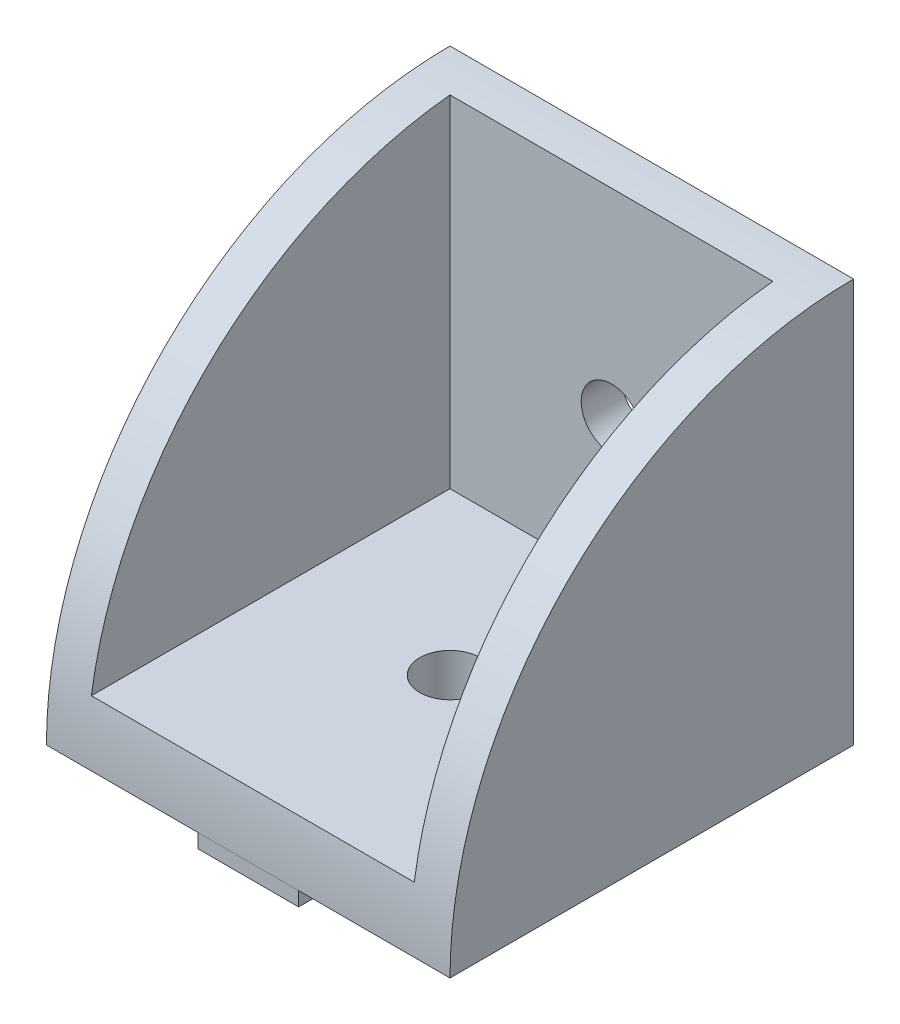
ISO-10303-21;
HEADER;
FILE_DESCRIPTION(('STEP AP214'),'2;1');
FILE_NAME('part.step','',(''),(''),'','','');
FILE_SCHEMA(('AUTOMOTIVE_DESIGN { 1 0 10303 214 1 1 1 1 }'));
ENDSEC;
DATA;
#1=APPLICATION_CONTEXT('core data for automotive mechanical design processes');
#2=APPLICATION_PROTOCOL_DEFINITION('international standard','automotive_design',2000,#1);
#3=PRODUCT_CONTEXT('',#1,'mechanical');
#4=PRODUCT('Part','Part','',(#3));
#5=PRODUCT_RELATED_PRODUCT_CATEGORY('part','',(#4));
#6=PRODUCT_DEFINITION_FORMATION('','',#4);
#7=PRODUCT_DEFINITION_CONTEXT('part definition',#1,'design');
#8=PRODUCT_DEFINITION('design','',#6,#7);
#9=PRODUCT_DEFINITION_SHAPE('','',#8);
#10=(LENGTH_UNIT() NAMED_UNIT(*) SI_UNIT(.MILLI.,.METRE.));
#11=(NAMED_UNIT(*) PLANE_ANGLE_UNIT() SI_UNIT($,.RADIAN.));
#12=(NAMED_UNIT(*) SI_UNIT($,.STERADIAN.) SOLID_ANGLE_UNIT());
#13=UNCERTAINTY_MEASURE_WITH_UNIT(LENGTH_MEASURE(1.E-05),#10,'distance_accuracy_value','');
#14=(GEOMETRIC_REPRESENTATION_CONTEXT(3) GLOBAL_UNCERTAINTY_ASSIGNED_CONTEXT((#13)) GLOBAL_UNIT_ASSIGNED_CONTEXT((#10,
#11,#12)) REPRESENTATION_CONTEXT('',''));
#15=CARTESIAN_POINT('',(0.,0.,0.));
#16=DIRECTION('',(0.,0.,1.));
#17=DIRECTION('',(1.,0.,0.));
#18=AXIS2_PLACEMENT_3D('',#15,#16,#17);
#19=CARTESIAN_POINT('',(0.,0.,0.));
#20=DIRECTION('',(0.,1.,0.));
#21=DIRECTION('',(-1.,0.,0.));
#22=AXIS2_PLACEMENT_3D('',#19,#20,#21);
#23=PLANE('',#22);
#24=DIRECTION('',(0.,0.,-1.));
#25=VECTOR('',#24,1.);
#26=CARTESIAN_POINT('',(7.5,0.,20.));
#27=LINE('',#26,#25);
#28=CARTESIAN_POINT('',(7.5,0.,20.));
#29=VERTEX_POINT('',#28);
#30=CARTESIAN_POINT('',(7.5,0.,0.));
#31=VERTEX_POINT('',#30);
#32=EDGE_CURVE('E57',#29,#31,#27,.T.);
#33=ORIENTED_EDGE('',*,*,#32,.F.);
#34=DIRECTION('',(-1.,0.,0.));
#35=VECTOR('',#34,1.);
#36=CARTESIAN_POINT('',(0.,0.,20.));
#37=LINE('',#36,#35);
#38=CARTESIAN_POINT('',(0.,0.,20.));
#39=VERTEX_POINT('',#38);
#40=EDGE_CURVE('E191',#29,#39,#37,.T.);
#41=ORIENTED_EDGE('',*,*,#40,.T.);
#42=DIRECTION('',(0.,0.,-1.));
#43=VECTOR('',#42,1.);
#44=CARTESIAN_POINT('',(0.,0.,0.));
#45=LINE('',#44,#43);
#46=CARTESIAN_POINT('',(0.,0.,0.));
#47=VERTEX_POINT('',#46);
#48=EDGE_CURVE('E182',#39,#47,#45,.T.);
#49=ORIENTED_EDGE('',*,*,#48,.T.);
#50=DIRECTION('',(1.,0.,0.));
#51=VECTOR('',#50,1.);
#52=CARTESIAN_POINT('',(0.,0.,0.));
#53=LINE('',#52,#51);
#54=EDGE_CURVE('E186',#47,#31,#53,.T.);
#55=ORIENTED_EDGE('',*,*,#54,.T.);
#56=EDGE_LOOP('',(#33,#41,#49,#55));
#57=FACE_BOUND('',#56,.T.);
#58=ADVANCED_FACE('F33',(#57),#23,.F.);
#59=CARTESIAN_POINT('',(0.,3.,0.));
#60=DIRECTION('',(0.,1.,0.));
#61=DIRECTION('',(0.,0.,1.));
#62=AXIS2_PLACEMENT_3D('',#59,#60,#61);
#63=PLANE('',#62);
#64=CARTESIAN_POINT('',(10.,2.99999999999996,10.));
#65=DIRECTION('',(0.,1.,0.));
#66=DIRECTION('',(0.,0.,1.));
#67=AXIS2_PLACEMENT_3D('',#64,#65,#66);
#68=CIRCLE('',#67,1.5);
#69=CARTESIAN_POINT('',(10.,2.99999999999996,11.5));
#70=VERTEX_POINT('',#69);
#71=EDGE_CURVE('E137',#70,#70,#68,.T.);
#72=ORIENTED_EDGE('',*,*,#71,.F.);
#73=EDGE_LOOP('',(#72));
#74=FACE_BOUND('',#73,.T.);
#75=DIRECTION('',(0.,0.,-1.));
#76=VECTOR('',#75,1.);
#77=CARTESIAN_POINT('',(2.,2.99999999999999,2.00000000000001));
#78=LINE('',#77,#76);
#79=CARTESIAN_POINT('',(2.00000000000001,2.99999999999993,19.7737199332852));
#80=VERTEX_POINT('',#79);
#81=CARTESIAN_POINT('',(2.,2.99999999999999,2.00000000000001));
#82=VERTEX_POINT('',#81);
#83=EDGE_CURVE('E153',#80,#82,#78,.T.);
#84=ORIENTED_EDGE('',*,*,#83,.F.);
#85=DIRECTION('',(-1.,0.,0.));
#86=VECTOR('',#85,1.);
#87=CARTESIAN_POINT('',(20.,2.99999999999993,19.7737199332852));
#88=LINE('',#87,#86);
#89=CARTESIAN_POINT('',(18.,2.99999999999993,19.7737199332852));
#90=VERTEX_POINT('',#89);
#91=EDGE_CURVE('E11',#80,#90,#88,.F.);
#92=ORIENTED_EDGE('',*,*,#91,.T.);
#93=DIRECTION('',(0.,0.,1.));
#94=VECTOR('',#93,1.);
#95=CARTESIAN_POINT('',(18.,2.99999999999999,2.00000000000001));
#96=LINE('',#95,#94);
#97=CARTESIAN_POINT('',(18.,2.99999999999999,2.00000000000001));
#98=VERTEX_POINT('',#97);
#99=EDGE_CURVE('E157',#98,#90,#96,.T.);
#100=ORIENTED_EDGE('',*,*,#99,.F.);
#101=DIRECTION('',(1.,0.,0.));
#102=VECTOR('',#101,1.);
#103=CARTESIAN_POINT('',(2.,2.99999999999999,2.00000000000001));
#104=LINE('',#103,#102);
#105=EDGE_CURVE('E155',#82,#98,#104,.T.);
#106=ORIENTED_EDGE('',*,*,#105,.F.);
#107=EDGE_LOOP('',(#84,#92,#100,#106));
#108=FACE_BOUND('',#107,.T.);
#109=ADVANCED_FACE('F224',(#74,#108),#63,.T.);
#110=CARTESIAN_POINT('',(0.,0.,0.));
#111=DIRECTION('',(1.,0.,0.));
#112=DIRECTION('',(0.,0.,-1.));
#113=AXIS2_PLACEMENT_3D('',#110,#111,#112);
#114=PLANE('',#113);
#115=CARTESIAN_POINT('',(0.,0.,0.));
#116=DIRECTION('',(-1.,0.,0.));
#117=DIRECTION('',(0.,0.,1.));
#118=AXIS2_PLACEMENT_3D('',#115,#116,#117);
#119=CIRCLE('',#118,20.);
#120=CARTESIAN_POINT('',(0.,20.,0.));
#121=VERTEX_POINT('',#120);
#122=EDGE_CURVE('E42',#39,#121,#119,.T.);
#123=ORIENTED_EDGE('',*,*,#122,.T.);
#124=DIRECTION('',(0.,-1.,0.));
#125=VECTOR('',#124,1.);
#126=CARTESIAN_POINT('',(0.,0.,0.));
#127=LINE('',#126,#125);
#128=EDGE_CURVE('E174',#121,#47,#127,.T.);
#129=ORIENTED_EDGE('',*,*,#128,.T.);
#130=ORIENTED_EDGE('',*,*,#48,.F.);
#131=EDGE_LOOP('',(#123,#129,#130));
#132=FACE_BOUND('',#131,.T.);
#133=ADVANCED_FACE('F199',(#132),#114,.F.);
#134=CARTESIAN_POINT('',(0.,0.,0.));
#135=DIRECTION('',(-1.,0.,0.));
#136=DIRECTION('',(0.,0.,1.));
#137=AXIS2_PLACEMENT_3D('',#134,#135,#136);
#138=CYLINDRICAL_SURFACE('',#137,20.);
#139=ORIENTED_EDGE('',*,*,#91,.F.);
#140=CARTESIAN_POINT('',(2.,0.,0.));
#141=DIRECTION('',(-1.,0.,0.));
#142=DIRECTION('',(0.,0.,1.));
#143=AXIS2_PLACEMENT_3D('',#140,#141,#142);
#144=CIRCLE('',#143,20.);
#145=CARTESIAN_POINT('',(2.,19.8997487421324,2.00000000000007));
#146=VERTEX_POINT('',#145);
#147=EDGE_CURVE('E172',#80,#146,#144,.T.);
#148=ORIENTED_EDGE('',*,*,#147,.T.);
#149=DIRECTION('',(-1.,0.,0.));
#150=VECTOR('',#149,1.);
#151=CARTESIAN_POINT('',(0.,19.8997487421324,2.00000000000007));
#152=LINE('',#151,#150);
#153=CARTESIAN_POINT('',(18.,19.8997487421324,2.00000000000007));
#154=VERTEX_POINT('',#153);
#155=EDGE_CURVE('E164',#146,#154,#152,.F.);
#156=ORIENTED_EDGE('',*,*,#155,.T.);
#157=CARTESIAN_POINT('',(18.,0.,0.));
#158=DIRECTION('',(1.,0.,0.));
#159=DIRECTION('',(0.,0.,-1.));
#160=AXIS2_PLACEMENT_3D('',#157,#158,#159);
#161=CIRCLE('',#160,20.);
#162=EDGE_CURVE('E169',#154,#90,#161,.T.);
#163=ORIENTED_EDGE('',*,*,#162,.T.);
#164=EDGE_LOOP('',(#139,#148,#156,#163));
#165=FACE_BOUND('',#164,.T.);
#166=ORIENTED_EDGE('',*,*,#122,.F.);
#167=ORIENTED_EDGE('',*,*,#40,.F.);
#168=DIRECTION('',(1.,0.,0.));
#169=VECTOR('',#168,1.);
#170=CARTESIAN_POINT('',(7.5,0.,20.));
#171=LINE('',#170,#169);
#172=CARTESIAN_POINT('',(12.5,0.,20.));
#173=VERTEX_POINT('',#172);
#174=EDGE_CURVE('E142',#29,#173,#171,.T.);
#175=ORIENTED_EDGE('',*,*,#174,.T.);
#176=CARTESIAN_POINT('',(20.,0.,20.));
#177=VERTEX_POINT('',#176);
#178=EDGE_CURVE('E192',#177,#173,#37,.T.);
#179=ORIENTED_EDGE('',*,*,#178,.F.);
#180=CARTESIAN_POINT('',(20.,0.,0.));
#181=DIRECTION('',(-1.,0.,0.));
#182=DIRECTION('',(0.,0.,1.));
#183=AXIS2_PLACEMENT_3D('',#180,#181,#182);
#184=CIRCLE('',#183,20.);
#185=CARTESIAN_POINT('',(20.,20.,0.));
#186=VERTEX_POINT('',#185);
#187=EDGE_CURVE('E194',#177,#186,#184,.T.);
#188=ORIENTED_EDGE('',*,*,#187,.T.);
#189=DIRECTION('',(-1.,0.,0.));
#190=VECTOR('',#189,1.);
#191=CARTESIAN_POINT('',(0.,20.,0.));
#192=LINE('',#191,#190);
#193=EDGE_CURVE('E179',#186,#121,#192,.T.);
#194=ORIENTED_EDGE('',*,*,#193,.T.);
#195=EDGE_LOOP('',(#166,#167,#175,#179,#188,#194));
#196=FACE_BOUND('',#195,.T.);
#197=ADVANCED_FACE('F35',(#165,#196),#138,.T.);
#198=CARTESIAN_POINT('',(20.,0.,0.));
#199=DIRECTION('',(-1.,0.,0.));
#200=DIRECTION('',(0.,0.,1.));
#201=AXIS2_PLACEMENT_3D('',#198,#199,#200);
#202=PLANE('',#201);
#203=DIRECTION('',(0.,1.,0.));
#204=VECTOR('',#203,1.);
#205=CARTESIAN_POINT('',(20.,0.,0.));
#206=LINE('',#205,#204);
#207=CARTESIAN_POINT('',(20.,0.,0.));
#208=VERTEX_POINT('',#207);
#209=EDGE_CURVE('E176',#208,#186,#206,.T.);
#210=ORIENTED_EDGE('',*,*,#209,.T.);
#211=ORIENTED_EDGE('',*,*,#187,.F.);
#212=DIRECTION('',(0.,0.,1.));
#213=VECTOR('',#212,1.);
#214=CARTESIAN_POINT('',(20.,0.,0.));
#215=LINE('',#214,#213);
#216=EDGE_CURVE('E188',#208,#177,#215,.T.);
#217=ORIENTED_EDGE('',*,*,#216,.F.);
#218=EDGE_LOOP('',(#210,#211,#217));
#219=FACE_BOUND('',#218,.T.);
#220=ADVANCED_FACE('F214',(#219),#202,.F.);
#221=ORIENTED_EDGE('',*,*,#178,.T.);
#222=DIRECTION('',(0.,0.,-1.));
#223=VECTOR('',#222,1.);
#224=CARTESIAN_POINT('',(12.5,0.,20.));
#225=LINE('',#224,#223);
#226=CARTESIAN_POINT('',(12.5,0.,0.));
#227=VERTEX_POINT('',#226);
#228=EDGE_CURVE('E49',#173,#227,#225,.T.);
#229=ORIENTED_EDGE('',*,*,#228,.T.);
#230=EDGE_CURVE('E185',#227,#208,#53,.T.);
#231=ORIENTED_EDGE('',*,*,#230,.T.);
#232=ORIENTED_EDGE('',*,*,#216,.T.);
#233=EDGE_LOOP('',(#221,#229,#231,#232));
#234=FACE_BOUND('',#233,.T.);
#235=ADVANCED_FACE('F212',(#234),#23,.F.);
#236=CARTESIAN_POINT('',(0.,0.,0.));
#237=DIRECTION('',(0.,0.,-1.));
#238=DIRECTION('',(-1.,0.,0.));
#239=AXIS2_PLACEMENT_3D('',#236,#237,#238);
#240=PLANE('',#239);
#241=CARTESIAN_POINT('',(10.,10.,0.));
#242=DIRECTION('',(0.,0.,-1.));
#243=DIRECTION('',(-1.,0.,0.));
#244=AXIS2_PLACEMENT_3D('',#241,#242,#243);
#245=CIRCLE('',#244,1.5);
#246=CARTESIAN_POINT('',(8.5,10.,0.));
#247=VERTEX_POINT('',#246);
#248=EDGE_CURVE('E146',#247,#247,#245,.T.);
#249=ORIENTED_EDGE('',*,*,#248,.F.);
#250=EDGE_LOOP('',(#249));
#251=FACE_BOUND('',#250,.T.);
#252=ORIENTED_EDGE('',*,*,#128,.F.);
#253=ORIENTED_EDGE('',*,*,#193,.F.);
#254=ORIENTED_EDGE('',*,*,#209,.F.);
#255=ORIENTED_EDGE('',*,*,#230,.F.);
#256=DIRECTION('',(0.,1.,0.));
#257=VECTOR('',#256,1.);
#258=CARTESIAN_POINT('',(12.5,-0.7,0.));
#259=LINE('',#258,#257);
#260=CARTESIAN_POINT('',(12.5,-0.7,0.));
#261=VERTEX_POINT('',#260);
#262=EDGE_CURVE('E119',#261,#227,#259,.T.);
#263=ORIENTED_EDGE('',*,*,#262,.F.);
#264=DIRECTION('',(1.,0.,0.));
#265=VECTOR('',#264,1.);
#266=CARTESIAN_POINT('',(7.5,-0.7,0.));
#267=LINE('',#266,#265);
#268=CARTESIAN_POINT('',(7.5,-0.7,0.));
#269=VERTEX_POINT('',#268);
#270=EDGE_CURVE('E127',#269,#261,#267,.T.);
#271=ORIENTED_EDGE('',*,*,#270,.F.);
#272=DIRECTION('',(0.,1.,0.));
#273=VECTOR('',#272,1.);
#274=CARTESIAN_POINT('',(7.5,-0.7,0.));
#275=LINE('',#274,#273);
#276=EDGE_CURVE('E147',#269,#31,#275,.T.);
#277=ORIENTED_EDGE('',*,*,#276,.T.);
#278=ORIENTED_EDGE('',*,*,#54,.F.);
#279=EDGE_LOOP('',(#252,#253,#254,#255,#263,#271,#277,#278));
#280=FACE_BOUND('',#279,.T.);
#281=ADVANCED_FACE('F207',(#251,#280),#240,.T.);
#282=CARTESIAN_POINT('',(2.,29.9999999999999,20.0000000000001));
#283=DIRECTION('',(-1.,0.,0.));
#284=DIRECTION('',(0.,0.,1.));
#285=AXIS2_PLACEMENT_3D('',#282,#283,#284);
#286=PLANE('',#285);
#287=ORIENTED_EDGE('',*,*,#147,.F.);
#288=ORIENTED_EDGE('',*,*,#83,.T.);
#289=DIRECTION('',(0.,-1.,0.));
#290=VECTOR('',#289,1.);
#291=CARTESIAN_POINT('',(2.,30.,2.0000000000001));
#292=LINE('',#291,#290);
#293=EDGE_CURVE('E160',#146,#82,#292,.T.);
#294=ORIENTED_EDGE('',*,*,#293,.F.);
#295=EDGE_LOOP('',(#287,#288,#294));
#296=FACE_BOUND('',#295,.T.);
#297=ADVANCED_FACE('F264',(#296),#286,.F.);
#298=CARTESIAN_POINT('',(18.,29.9999999999999,20.0000000000001));
#299=DIRECTION('',(1.,0.,0.));
#300=DIRECTION('',(0.,0.,-1.));
#301=AXIS2_PLACEMENT_3D('',#298,#299,#300);
#302=PLANE('',#301);
#303=DIRECTION('',(0.,-1.,0.));
#304=VECTOR('',#303,1.);
#305=CARTESIAN_POINT('',(18.,30.,2.0000000000001));
#306=LINE('',#305,#304);
#307=EDGE_CURVE('E161',#154,#98,#306,.T.);
#308=ORIENTED_EDGE('',*,*,#307,.T.);
#309=ORIENTED_EDGE('',*,*,#99,.T.);
#310=ORIENTED_EDGE('',*,*,#162,.F.);
#311=EDGE_LOOP('',(#308,#309,#310));
#312=FACE_BOUND('',#311,.T.);
#313=ADVANCED_FACE('F324',(#312),#302,.F.);
#314=CARTESIAN_POINT('',(2.,30.,2.0000000000001));
#315=DIRECTION('',(0.,0.,-1.));
#316=DIRECTION('',(0.,1.,0.));
#317=AXIS2_PLACEMENT_3D('',#314,#315,#316);
#318=PLANE('',#317);
#319=CARTESIAN_POINT('',(10.,10.,2.00000000000004));
#320=DIRECTION('',(0.,0.,-1.));
#321=DIRECTION('',(0.,1.,0.));
#322=AXIS2_PLACEMENT_3D('',#319,#320,#321);
#323=CIRCLE('',#322,1.5);
#324=CARTESIAN_POINT('',(10.,11.5,2.00000000000004));
#325=VERTEX_POINT('',#324);
#326=EDGE_CURVE('E37',#325,#325,#323,.T.);
#327=ORIENTED_EDGE('',*,*,#326,.T.);
#328=EDGE_LOOP('',(#327));
#329=FACE_BOUND('',#328,.T.);
#330=ORIENTED_EDGE('',*,*,#293,.T.);
#331=ORIENTED_EDGE('',*,*,#105,.T.);
#332=ORIENTED_EDGE('',*,*,#307,.F.);
#333=ORIENTED_EDGE('',*,*,#155,.F.);
#334=EDGE_LOOP('',(#330,#331,#332,#333));
#335=FACE_BOUND('',#334,.T.);
#336=ADVANCED_FACE('F321',(#329,#335),#318,.F.);
#337=CARTESIAN_POINT('',(10.,10.,20.));
#338=DIRECTION('',(0.,0.,-1.));
#339=DIRECTION('',(-1.,0.,0.));
#340=AXIS2_PLACEMENT_3D('',#337,#338,#339);
#341=CYLINDRICAL_SURFACE('',#340,1.5);
#342=ORIENTED_EDGE('',*,*,#248,.T.);
#343=EDGE_LOOP('',(#342));
#344=FACE_BOUND('',#343,.T.);
#345=ORIENTED_EDGE('',*,*,#326,.F.);
#346=EDGE_LOOP('',(#345));
#347=FACE_BOUND('',#346,.T.);
#348=ADVANCED_FACE('F275',(#344,#347),#341,.F.);
#349=CARTESIAN_POINT('',(7.5,-0.70000000000007,20.));
#350=DIRECTION('',(0.,0.,1.));
#351=DIRECTION('',(0.,-1.,0.));
#352=AXIS2_PLACEMENT_3D('',#349,#350,#351);
#353=PLANE('',#352);
#354=ORIENTED_EDGE('',*,*,#174,.F.);
#355=DIRECTION('',(0.,1.,0.));
#356=VECTOR('',#355,1.);
#357=CARTESIAN_POINT('',(7.5,-0.70000000000007,20.));
#358=LINE('',#357,#356);
#359=CARTESIAN_POINT('',(7.5,-0.70000000000007,20.));
#360=VERTEX_POINT('',#359);
#361=EDGE_CURVE('E132',#360,#29,#358,.T.);
#362=ORIENTED_EDGE('',*,*,#361,.F.);
#363=DIRECTION('',(1.,0.,0.));
#364=VECTOR('',#363,1.);
#365=CARTESIAN_POINT('',(7.5,-0.70000000000007,20.));
#366=LINE('',#365,#364);
#367=CARTESIAN_POINT('',(12.5,-0.70000000000007,20.));
#368=VERTEX_POINT('',#367);
#369=EDGE_CURVE('E125',#360,#368,#366,.T.);
#370=ORIENTED_EDGE('',*,*,#369,.T.);
#371=DIRECTION('',(0.,1.,0.));
#372=VECTOR('',#371,1.);
#373=CARTESIAN_POINT('',(12.5,-0.70000000000007,20.));
#374=LINE('',#373,#372);
#375=EDGE_CURVE('E111',#368,#173,#374,.T.);
#376=ORIENTED_EDGE('',*,*,#375,.T.);
#377=EDGE_LOOP('',(#354,#362,#370,#376));
#378=FACE_BOUND('',#377,.T.);
#379=ADVANCED_FACE('F130',(#378),#353,.T.);
#380=CARTESIAN_POINT('',(7.5,-0.70000000000007,20.));
#381=DIRECTION('',(1.,0.,0.));
#382=DIRECTION('',(0.,0.,-1.));
#383=AXIS2_PLACEMENT_3D('',#380,#381,#382);
#384=PLANE('',#383);
#385=ORIENTED_EDGE('',*,*,#32,.T.);
#386=ORIENTED_EDGE('',*,*,#276,.F.);
#387=DIRECTION('',(0.,0.,-1.));
#388=VECTOR('',#387,1.);
#389=CARTESIAN_POINT('',(7.5,-0.70000000000007,20.));
#390=LINE('',#389,#388);
#391=EDGE_CURVE('E120',#360,#269,#390,.T.);
#392=ORIENTED_EDGE('',*,*,#391,.F.);
#393=ORIENTED_EDGE('',*,*,#361,.T.);
#394=EDGE_LOOP('',(#385,#386,#392,#393));
#395=FACE_BOUND('',#394,.T.);
#396=ADVANCED_FACE('F210',(#395),#384,.F.);
#397=CARTESIAN_POINT('',(12.5,-0.70000000000007,20.));
#398=DIRECTION('',(1.,0.,0.));
#399=DIRECTION('',(0.,0.,-1.));
#400=AXIS2_PLACEMENT_3D('',#397,#398,#399);
#401=PLANE('',#400);
#402=ORIENTED_EDGE('',*,*,#228,.F.);
#403=ORIENTED_EDGE('',*,*,#375,.F.);
#404=DIRECTION('',(0.,0.,-1.));
#405=VECTOR('',#404,1.);
#406=CARTESIAN_POINT('',(12.5,-0.70000000000007,20.));
#407=LINE('',#406,#405);
#408=EDGE_CURVE('E115',#368,#261,#407,.T.);
#409=ORIENTED_EDGE('',*,*,#408,.T.);
#410=ORIENTED_EDGE('',*,*,#262,.T.);
#411=EDGE_LOOP('',(#402,#403,#409,#410));
#412=FACE_BOUND('',#411,.T.);
#413=ADVANCED_FACE('F113',(#412),#401,.T.);
#414=CARTESIAN_POINT('',(0.,-0.7,0.));
#415=DIRECTION('',(0.,1.,0.));
#416=DIRECTION('',(0.,0.,1.));
#417=AXIS2_PLACEMENT_3D('',#414,#415,#416);
#418=PLANE('',#417);
#419=CARTESIAN_POINT('',(10.,-0.700000000000035,10.));
#420=DIRECTION('',(0.,-1.,0.));
#421=DIRECTION('',(0.,0.,-1.));
#422=AXIS2_PLACEMENT_3D('',#419,#420,#421);
#423=CIRCLE('',#422,1.5);
#424=CARTESIAN_POINT('',(10.,-0.70000000000003,8.5));
#425=VERTEX_POINT('',#424);
#426=EDGE_CURVE('E385',#425,#425,#423,.T.);
#427=ORIENTED_EDGE('',*,*,#426,.F.);
#428=EDGE_LOOP('',(#427));
#429=FACE_BOUND('',#428,.T.);
#430=ORIENTED_EDGE('',*,*,#369,.F.);
#431=ORIENTED_EDGE('',*,*,#391,.T.);
#432=ORIENTED_EDGE('',*,*,#270,.T.);
#433=ORIENTED_EDGE('',*,*,#408,.F.);
#434=EDGE_LOOP('',(#430,#431,#432,#433));
#435=FACE_BOUND('',#434,.T.);
#436=ADVANCED_FACE('F124',(#429,#435),#418,.F.);
#437=CARTESIAN_POINT('',(10.,99.3,10.0000000000003));
#438=DIRECTION('',(0.,-1.,0.));
#439=DIRECTION('',(0.,0.,-1.));
#440=AXIS2_PLACEMENT_3D('',#437,#438,#439);
#441=CYLINDRICAL_SURFACE('',#440,1.5);
#442=ORIENTED_EDGE('',*,*,#71,.T.);
#443=EDGE_LOOP('',(#442));
#444=FACE_BOUND('',#443,.T.);
#445=ORIENTED_EDGE('',*,*,#426,.T.);
#446=EDGE_LOOP('',(#445));
#447=FACE_BOUND('',#446,.T.);
#448=ADVANCED_FACE('F304',(#444,#447),#441,.F.);
#449=CLOSED_SHELL('',(#58,#109,#133,#197,#220,#235,#281,#297,#313,#336,#348,#379,#396,#413,#436,#448));
#450=MANIFOLD_SOLID_BREP('B2',#449);
#451=ADVANCED_BREP_SHAPE_REPRESENTATION('',(#18,#450),#14);
#452=SHAPE_DEFINITION_REPRESENTATION(#9,#451);
ENDSEC;
END-ISO-10303-21;
